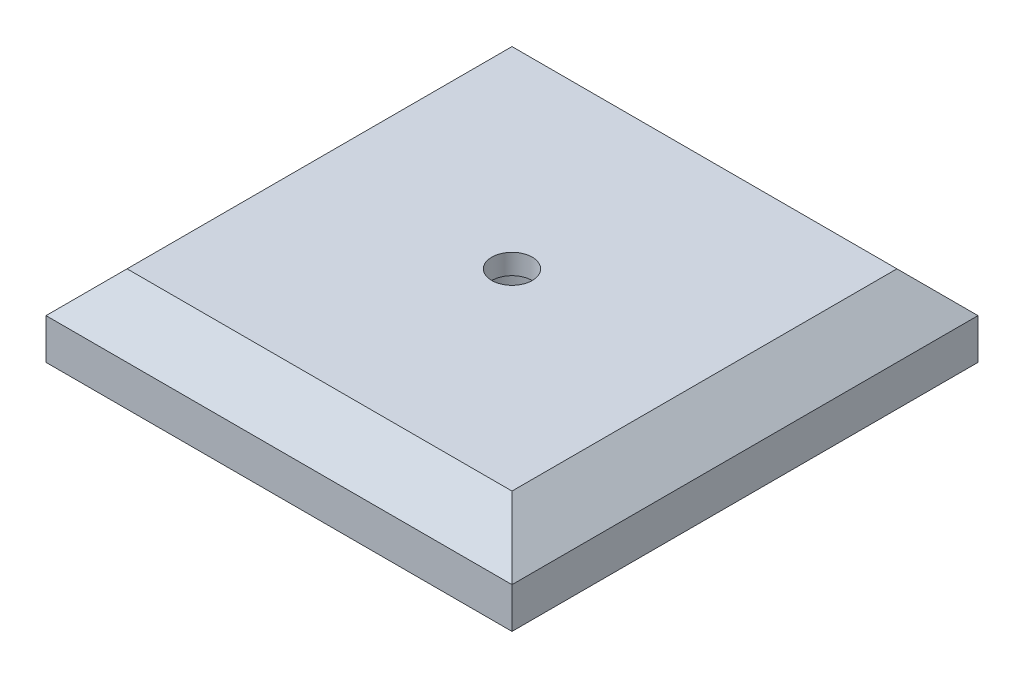
ISO-10303-21;
HEADER;
FILE_DESCRIPTION(('STEP AP214'),'2;1');
FILE_NAME('part.step','',(''),(''),'','','');
FILE_SCHEMA(('AUTOMOTIVE_DESIGN { 1 0 10303 214 1 1 1 1 }'));
ENDSEC;
DATA;
#1=APPLICATION_CONTEXT('core data for automotive mechanical design processes');
#2=APPLICATION_PROTOCOL_DEFINITION('international standard','automotive_design',2000,#1);
#3=PRODUCT_CONTEXT('',#1,'mechanical');
#4=PRODUCT('Part','Part','',(#3));
#5=PRODUCT_RELATED_PRODUCT_CATEGORY('part','',(#4));
#6=PRODUCT_DEFINITION_FORMATION('','',#4);
#7=PRODUCT_DEFINITION_CONTEXT('part definition',#1,'design');
#8=PRODUCT_DEFINITION('design','',#6,#7);
#9=PRODUCT_DEFINITION_SHAPE('','',#8);
#10=(LENGTH_UNIT() NAMED_UNIT(*) SI_UNIT(.MILLI.,.METRE.));
#11=(NAMED_UNIT(*) PLANE_ANGLE_UNIT() SI_UNIT($,.RADIAN.));
#12=(NAMED_UNIT(*) SI_UNIT($,.STERADIAN.) SOLID_ANGLE_UNIT());
#13=UNCERTAINTY_MEASURE_WITH_UNIT(LENGTH_MEASURE(1.E-05),#10,'distance_accuracy_value','');
#14=(GEOMETRIC_REPRESENTATION_CONTEXT(3) GLOBAL_UNCERTAINTY_ASSIGNED_CONTEXT((#13)) GLOBAL_UNIT_ASSIGNED_CONTEXT((#10,
#11,#12)) REPRESENTATION_CONTEXT('',''));
#15=CARTESIAN_POINT('',(0.,0.,0.));
#16=DIRECTION('',(0.,0.,1.));
#17=DIRECTION('',(1.,0.,0.));
#18=AXIS2_PLACEMENT_3D('',#15,#16,#17);
#19=CARTESIAN_POINT('',(1.4375,0.5,-1.4375));
#20=DIRECTION('',(-1.,0.,0.));
#21=DIRECTION('',(0.,0.,1.));
#22=AXIS2_PLACEMENT_3D('',#19,#20,#21);
#23=PLANE('',#22);
#24=DIRECTION('',(0.,-1.,0.));
#25=VECTOR('',#24,1.);
#26=CARTESIAN_POINT('',(1.4375,0.5,-1.4375));
#27=LINE('',#26,#25);
#28=CARTESIAN_POINT('',(1.4375,0.249999999999999,-1.4375));
#29=VERTEX_POINT('',#28);
#30=CARTESIAN_POINT('',(1.4375,0.,-1.4375));
#31=VERTEX_POINT('',#30);
#32=EDGE_CURVE('E93',#29,#31,#27,.T.);
#33=ORIENTED_EDGE('',*,*,#32,.F.);
#34=DIRECTION('',(0.,0.,1.));
#35=VECTOR('',#34,1.);
#36=CARTESIAN_POINT('',(1.4375,0.249999999999999,1.1875));
#37=LINE('',#36,#35);
#38=CARTESIAN_POINT('',(1.4375,0.249999999999999,1.4375));
#39=VERTEX_POINT('',#38);
#40=EDGE_CURVE('E138',#29,#39,#37,.T.);
#41=ORIENTED_EDGE('',*,*,#40,.T.);
#42=DIRECTION('',(0.,-1.,0.));
#43=VECTOR('',#42,1.);
#44=CARTESIAN_POINT('',(1.4375,0.5,1.4375));
#45=LINE('',#44,#43);
#46=CARTESIAN_POINT('',(1.4375,0.,1.4375));
#47=VERTEX_POINT('',#46);
#48=EDGE_CURVE('E115',#39,#47,#45,.T.);
#49=ORIENTED_EDGE('',*,*,#48,.T.);
#50=DIRECTION('',(0.,0.,-1.));
#51=VECTOR('',#50,1.);
#52=CARTESIAN_POINT('',(1.4375,0.,-1.4375));
#53=LINE('',#52,#51);
#54=EDGE_CURVE('E110',#47,#31,#53,.T.);
#55=ORIENTED_EDGE('',*,*,#54,.T.);
#56=EDGE_LOOP('',(#33,#41,#49,#55));
#57=FACE_BOUND('',#56,.T.);
#58=ADVANCED_FACE('F38',(#57),#23,.F.);
#59=CARTESIAN_POINT('',(-1.4375,0.5,-1.4375));
#60=DIRECTION('',(0.,0.,1.));
#61=DIRECTION('',(1.,0.,0.));
#62=AXIS2_PLACEMENT_3D('',#59,#60,#61);
#63=PLANE('',#62);
#64=DIRECTION('',(0.,-1.,0.));
#65=VECTOR('',#64,1.);
#66=CARTESIAN_POINT('',(-1.4375,0.5,-1.4375));
#67=LINE('',#66,#65);
#68=CARTESIAN_POINT('',(-1.4375,0.249999999999999,-1.4375));
#69=VERTEX_POINT('',#68);
#70=CARTESIAN_POINT('',(-1.4375,0.,-1.4375));
#71=VERTEX_POINT('',#70);
#72=EDGE_CURVE('E104',#69,#71,#67,.T.);
#73=ORIENTED_EDGE('',*,*,#72,.F.);
#74=DIRECTION('',(1.,0.,0.));
#75=VECTOR('',#74,1.);
#76=CARTESIAN_POINT('',(1.1875,0.249999999999999,-1.4375));
#77=LINE('',#76,#75);
#78=EDGE_CURVE('E99',#69,#29,#77,.T.);
#79=ORIENTED_EDGE('',*,*,#78,.T.);
#80=ORIENTED_EDGE('',*,*,#32,.T.);
#81=DIRECTION('',(-1.,0.,0.));
#82=VECTOR('',#81,1.);
#83=CARTESIAN_POINT('',(-1.4375,0.,-1.4375));
#84=LINE('',#83,#82);
#85=EDGE_CURVE('E97',#31,#71,#84,.T.);
#86=ORIENTED_EDGE('',*,*,#85,.T.);
#87=EDGE_LOOP('',(#73,#79,#80,#86));
#88=FACE_BOUND('',#87,.T.);
#89=ADVANCED_FACE('F96',(#88),#63,.F.);
#90=CARTESIAN_POINT('',(-1.4375,0.5,-1.4375));
#91=DIRECTION('',(1.,0.,0.));
#92=DIRECTION('',(0.,0.,-1.));
#93=AXIS2_PLACEMENT_3D('',#90,#91,#92);
#94=PLANE('',#93);
#95=DIRECTION('',(0.,-1.,0.));
#96=VECTOR('',#95,1.);
#97=CARTESIAN_POINT('',(-1.4375,0.5,1.4375));
#98=LINE('',#97,#96);
#99=CARTESIAN_POINT('',(-1.4375,0.249999999999999,1.4375));
#100=VERTEX_POINT('',#99);
#101=CARTESIAN_POINT('',(-1.4375,0.,1.4375));
#102=VERTEX_POINT('',#101);
#103=EDGE_CURVE('E128',#100,#102,#98,.T.);
#104=ORIENTED_EDGE('',*,*,#103,.F.);
#105=DIRECTION('',(0.,0.,-1.));
#106=VECTOR('',#105,1.);
#107=CARTESIAN_POINT('',(-1.4375,0.249999999999999,-1.1875));
#108=LINE('',#107,#106);
#109=EDGE_CURVE('E47',#100,#69,#108,.T.);
#110=ORIENTED_EDGE('',*,*,#109,.T.);
#111=ORIENTED_EDGE('',*,*,#72,.T.);
#112=DIRECTION('',(0.,0.,1.));
#113=VECTOR('',#112,1.);
#114=CARTESIAN_POINT('',(-1.4375,0.,-1.4375));
#115=LINE('',#114,#113);
#116=EDGE_CURVE('E112',#71,#102,#115,.T.);
#117=ORIENTED_EDGE('',*,*,#116,.T.);
#118=EDGE_LOOP('',(#104,#110,#111,#117));
#119=FACE_BOUND('',#118,.T.);
#120=ADVANCED_FACE('F152',(#119),#94,.F.);
#121=CARTESIAN_POINT('',(-1.4375,0.5,1.4375));
#122=DIRECTION('',(0.,0.,-1.));
#123=DIRECTION('',(-1.,0.,0.));
#124=AXIS2_PLACEMENT_3D('',#121,#122,#123);
#125=PLANE('',#124);
#126=ORIENTED_EDGE('',*,*,#48,.F.);
#127=DIRECTION('',(-1.,0.,0.));
#128=VECTOR('',#127,1.);
#129=CARTESIAN_POINT('',(-1.4375,0.249999999999999,1.4375));
#130=LINE('',#129,#128);
#131=EDGE_CURVE('E132',#39,#100,#130,.T.);
#132=ORIENTED_EDGE('',*,*,#131,.T.);
#133=ORIENTED_EDGE('',*,*,#103,.T.);
#134=DIRECTION('',(1.,0.,0.));
#135=VECTOR('',#134,1.);
#136=CARTESIAN_POINT('',(-1.4375,0.,1.4375));
#137=LINE('',#136,#135);
#138=EDGE_CURVE('E125',#102,#47,#137,.T.);
#139=ORIENTED_EDGE('',*,*,#138,.T.);
#140=EDGE_LOOP('',(#126,#132,#133,#139));
#141=FACE_BOUND('',#140,.T.);
#142=ADVANCED_FACE('F166',(#141),#125,.F.);
#143=CARTESIAN_POINT('',(0.,0.5,0.));
#144=DIRECTION('',(0.,1.,0.));
#145=DIRECTION('',(0.,0.,1.));
#146=AXIS2_PLACEMENT_3D('',#143,#144,#145);
#147=PLANE('',#146);
#148=CARTESIAN_POINT('',(0.,0.5,0.));
#149=DIRECTION('',(0.,1.,0.));
#150=DIRECTION('',(0.,0.,1.));
#151=AXIS2_PLACEMENT_3D('',#148,#149,#150);
#152=CIRCLE('',#151,0.125);
#153=CARTESIAN_POINT('',(0.,0.5,0.125));
#154=VERTEX_POINT('',#153);
#155=EDGE_CURVE('E289',#154,#154,#152,.T.);
#156=ORIENTED_EDGE('',*,*,#155,.F.);
#157=EDGE_LOOP('',(#156));
#158=FACE_BOUND('',#157,.T.);
#159=DIRECTION('',(-1.,0.,0.));
#160=VECTOR('',#159,1.);
#161=CARTESIAN_POINT('',(-1.4375,0.5,-1.1875));
#162=LINE('',#161,#160);
#163=CARTESIAN_POINT('',(1.1875,0.5,-1.1875));
#164=VERTEX_POINT('',#163);
#165=CARTESIAN_POINT('',(-1.1875,0.5,-1.1875));
#166=VERTEX_POINT('',#165);
#167=EDGE_CURVE('E143',#164,#166,#162,.T.);
#168=ORIENTED_EDGE('',*,*,#167,.T.);
#169=DIRECTION('',(0.,0.,1.));
#170=VECTOR('',#169,1.);
#171=CARTESIAN_POINT('',(-1.1875,0.5,1.1875));
#172=LINE('',#171,#170);
#173=CARTESIAN_POINT('',(-1.1875,0.5,1.1875));
#174=VERTEX_POINT('',#173);
#175=EDGE_CURVE('E148',#166,#174,#172,.T.);
#176=ORIENTED_EDGE('',*,*,#175,.T.);
#177=DIRECTION('',(1.,0.,0.));
#178=VECTOR('',#177,1.);
#179=CARTESIAN_POINT('',(1.4375,0.5,1.1875));
#180=LINE('',#179,#178);
#181=CARTESIAN_POINT('',(1.1875,0.5,1.1875));
#182=VERTEX_POINT('',#181);
#183=EDGE_CURVE('E103',#174,#182,#180,.T.);
#184=ORIENTED_EDGE('',*,*,#183,.T.);
#185=DIRECTION('',(0.,0.,-1.));
#186=VECTOR('',#185,1.);
#187=CARTESIAN_POINT('',(1.1875,0.5,-1.4375));
#188=LINE('',#187,#186);
#189=EDGE_CURVE('E135',#182,#164,#188,.T.);
#190=ORIENTED_EDGE('',*,*,#189,.T.);
#191=EDGE_LOOP('',(#168,#176,#184,#190));
#192=FACE_BOUND('',#191,.T.);
#193=ADVANCED_FACE('F157',(#158,#192),#147,.T.);
#194=CARTESIAN_POINT('',(0.,0.,0.));
#195=DIRECTION('',(0.,1.,0.));
#196=DIRECTION('',(0.,0.,1.));
#197=AXIS2_PLACEMENT_3D('',#194,#195,#196);
#198=PLANE('',#197);
#199=CARTESIAN_POINT('',(0.,0.,0.));
#200=DIRECTION('',(0.,1.,0.));
#201=DIRECTION('',(0.,0.,1.));
#202=AXIS2_PLACEMENT_3D('',#199,#200,#201);
#203=CIRCLE('',#202,0.25271806551586);
#204=CARTESIAN_POINT('',(0.,0.,0.25271806551586));
#205=VERTEX_POINT('',#204);
#206=EDGE_CURVE('E120',#205,#205,#203,.T.);
#207=ORIENTED_EDGE('',*,*,#206,.T.);
#208=EDGE_LOOP('',(#207));
#209=FACE_BOUND('',#208,.T.);
#210=ORIENTED_EDGE('',*,*,#54,.F.);
#211=ORIENTED_EDGE('',*,*,#138,.F.);
#212=ORIENTED_EDGE('',*,*,#116,.F.);
#213=ORIENTED_EDGE('',*,*,#85,.F.);
#214=EDGE_LOOP('',(#210,#211,#212,#213));
#215=FACE_BOUND('',#214,.T.);
#216=ADVANCED_FACE('F108',(#209,#215),#198,.F.);
#217=CARTESIAN_POINT('',(0.,0.375,0.));
#218=DIRECTION('',(0.,-1.,0.));
#219=DIRECTION('',(0.,0.,-1.));
#220=AXIS2_PLACEMENT_3D('',#217,#218,#219);
#221=CYLINDRICAL_SURFACE('',#220,0.25271806551586);
#222=CARTESIAN_POINT('',(0.,0.375,0.));
#223=DIRECTION('',(0.,1.,0.));
#224=DIRECTION('',(0.,0.,1.));
#225=AXIS2_PLACEMENT_3D('',#222,#223,#224);
#226=CIRCLE('',#225,0.25271806551586);
#227=CARTESIAN_POINT('',(0.,0.375,0.25271806551586));
#228=VERTEX_POINT('',#227);
#229=EDGE_CURVE('E117',#228,#228,#226,.T.);
#230=ORIENTED_EDGE('',*,*,#229,.T.);
#231=EDGE_LOOP('',(#230));
#232=FACE_BOUND('',#231,.T.);
#233=ORIENTED_EDGE('',*,*,#206,.F.);
#234=EDGE_LOOP('',(#233));
#235=FACE_BOUND('',#234,.T.);
#236=ADVANCED_FACE('F266',(#232,#235),#221,.F.);
#237=CARTESIAN_POINT('',(0.,0.375,0.));
#238=DIRECTION('',(0.,1.,0.));
#239=DIRECTION('',(0.,0.,1.));
#240=AXIS2_PLACEMENT_3D('',#237,#238,#239);
#241=PLANE('',#240);
#242=CARTESIAN_POINT('',(0.,0.375,0.));
#243=DIRECTION('',(0.,1.,0.));
#244=DIRECTION('',(0.,0.,1.));
#245=AXIS2_PLACEMENT_3D('',#242,#243,#244);
#246=CIRCLE('',#245,0.125);
#247=CARTESIAN_POINT('',(0.,0.375,0.125));
#248=VERTEX_POINT('',#247);
#249=EDGE_CURVE('E291',#248,#248,#246,.T.);
#250=ORIENTED_EDGE('',*,*,#249,.T.);
#251=EDGE_LOOP('',(#250));
#252=FACE_BOUND('',#251,.T.);
#253=ORIENTED_EDGE('',*,*,#229,.F.);
#254=EDGE_LOOP('',(#253));
#255=FACE_BOUND('',#254,.T.);
#256=ADVANCED_FACE('F256',(#252,#255),#241,.F.);
#257=CARTESIAN_POINT('',(0.,0.5,0.));
#258=DIRECTION('',(0.,-1.,0.));
#259=DIRECTION('',(0.,0.,-1.));
#260=AXIS2_PLACEMENT_3D('',#257,#258,#259);
#261=CYLINDRICAL_SURFACE('',#260,0.125);
#262=ORIENTED_EDGE('',*,*,#155,.T.);
#263=EDGE_LOOP('',(#262));
#264=FACE_BOUND('',#263,.T.);
#265=ORIENTED_EDGE('',*,*,#249,.F.);
#266=EDGE_LOOP('',(#265));
#267=FACE_BOUND('',#266,.T.);
#268=ADVANCED_FACE('F190',(#264,#267),#261,.F.);
#269=CARTESIAN_POINT('',(0.,0.5,1.1875));
#270=DIRECTION('',(0.,0.707106781186546,0.707106781186549));
#271=DIRECTION('',(-1.,0.,0.));
#272=AXIS2_PLACEMENT_3D('',#269,#270,#271);
#273=PLANE('',#272);
#274=ORIENTED_EDGE('',*,*,#183,.F.);
#275=DIRECTION('',(-0.577350269189625,-0.577350269189627,0.577350269189625));
#276=VECTOR('',#275,1.);
#277=CARTESIAN_POINT('',(-0.791666666666667,0.895833333333334,0.791666666666667));
#278=LINE('',#277,#276);
#279=EDGE_CURVE('E54',#174,#100,#278,.T.);
#280=ORIENTED_EDGE('',*,*,#279,.T.);
#281=ORIENTED_EDGE('',*,*,#131,.F.);
#282=DIRECTION('',(-0.577350269189625,0.577350269189627,-0.577350269189625));
#283=VECTOR('',#282,1.);
#284=CARTESIAN_POINT('',(0.791666666666667,0.895833333333334,0.791666666666667));
#285=LINE('',#284,#283);
#286=EDGE_CURVE('E140',#39,#182,#285,.T.);
#287=ORIENTED_EDGE('',*,*,#286,.T.);
#288=EDGE_LOOP('',(#274,#280,#281,#287));
#289=FACE_BOUND('',#288,.T.);
#290=ADVANCED_FACE('F159',(#289),#273,.T.);
#291=CARTESIAN_POINT('',(1.1875,0.5,0.));
#292=DIRECTION('',(0.707106781186549,0.707106781186546,0.));
#293=DIRECTION('',(0.,0.,1.));
#294=AXIS2_PLACEMENT_3D('',#291,#292,#293);
#295=PLANE('',#294);
#296=ORIENTED_EDGE('',*,*,#40,.F.);
#297=DIRECTION('',(-0.577350269189625,0.577350269189627,0.577350269189625));
#298=VECTOR('',#297,1.);
#299=CARTESIAN_POINT('',(0.791666666666667,0.895833333333334,-0.791666666666667));
#300=LINE('',#299,#298);
#301=EDGE_CURVE('E146',#29,#164,#300,.T.);
#302=ORIENTED_EDGE('',*,*,#301,.T.);
#303=ORIENTED_EDGE('',*,*,#189,.F.);
#304=ORIENTED_EDGE('',*,*,#286,.F.);
#305=EDGE_LOOP('',(#296,#302,#303,#304));
#306=FACE_BOUND('',#305,.T.);
#307=ADVANCED_FACE('F164',(#306),#295,.T.);
#308=CARTESIAN_POINT('',(0.,0.5,-1.1875));
#309=DIRECTION('',(0.,0.707106781186546,-0.707106781186549));
#310=DIRECTION('',(1.,0.,0.));
#311=AXIS2_PLACEMENT_3D('',#308,#309,#310);
#312=PLANE('',#311);
#313=ORIENTED_EDGE('',*,*,#78,.F.);
#314=DIRECTION('',(0.577350269189625,0.577350269189627,0.577350269189625));
#315=VECTOR('',#314,1.);
#316=CARTESIAN_POINT('',(-0.791666666666667,0.895833333333334,-0.791666666666667));
#317=LINE('',#316,#315);
#318=EDGE_CURVE('E11',#69,#166,#317,.T.);
#319=ORIENTED_EDGE('',*,*,#318,.T.);
#320=ORIENTED_EDGE('',*,*,#167,.F.);
#321=ORIENTED_EDGE('',*,*,#301,.F.);
#322=EDGE_LOOP('',(#313,#319,#320,#321));
#323=FACE_BOUND('',#322,.T.);
#324=ADVANCED_FACE('F154',(#323),#312,.T.);
#325=CARTESIAN_POINT('',(-1.1875,0.5,0.));
#326=DIRECTION('',(-0.707106781186549,0.707106781186546,0.));
#327=DIRECTION('',(0.,0.,-1.));
#328=AXIS2_PLACEMENT_3D('',#325,#326,#327);
#329=PLANE('',#328);
#330=ORIENTED_EDGE('',*,*,#318,.F.);
#331=ORIENTED_EDGE('',*,*,#109,.F.);
#332=ORIENTED_EDGE('',*,*,#279,.F.);
#333=ORIENTED_EDGE('',*,*,#175,.F.);
#334=EDGE_LOOP('',(#330,#331,#332,#333));
#335=FACE_BOUND('',#334,.T.);
#336=ADVANCED_FACE('F41',(#335),#329,.T.);
#337=CLOSED_SHELL('',(#58,#89,#120,#142,#193,#216,#236,#256,#268,#290,#307,#324,#336));
#338=MANIFOLD_SOLID_BREP('B2',#337);
#339=ADVANCED_BREP_SHAPE_REPRESENTATION('',(#18,#338),#14);
#340=SHAPE_DEFINITION_REPRESENTATION(#9,#339);
ENDSEC;
END-ISO-10303-21;
